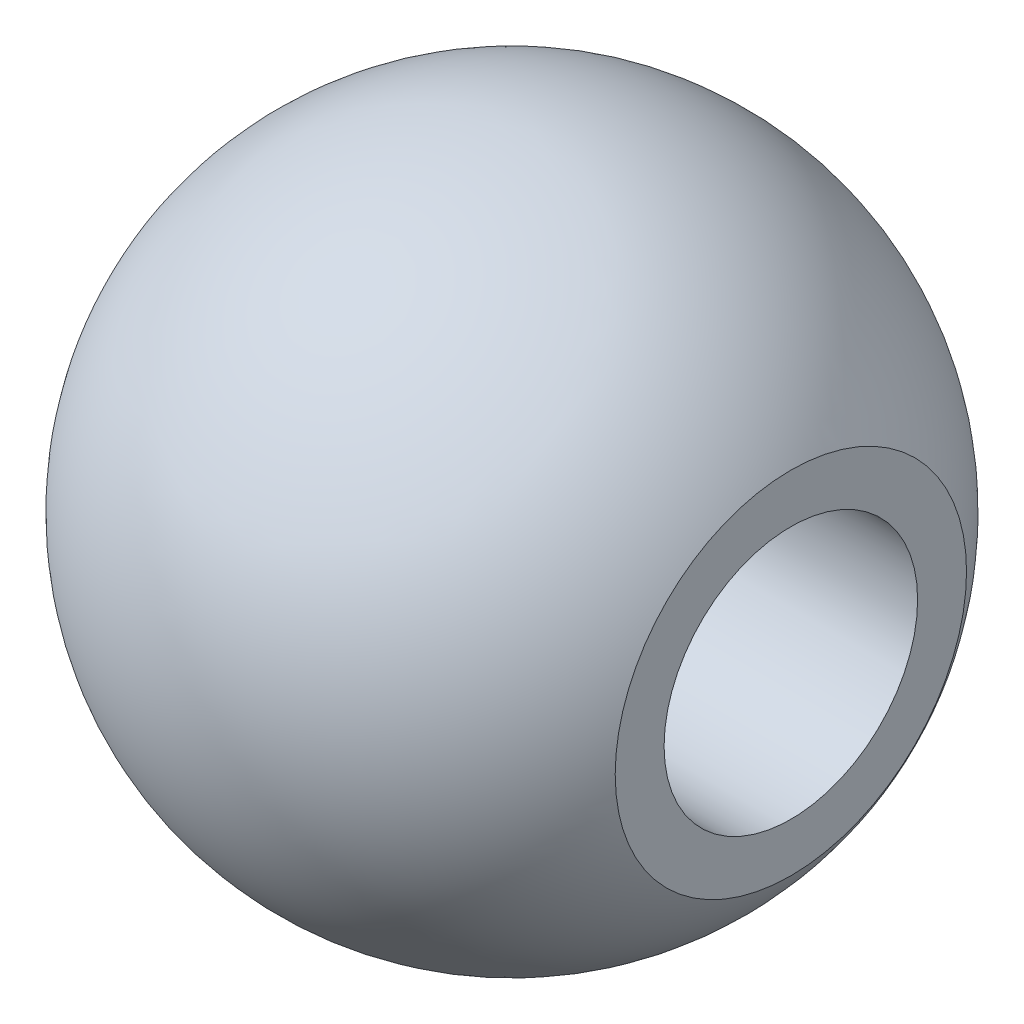
ISO-10303-21;
HEADER;
FILE_DESCRIPTION(('STEP AP214'),'2;1');
FILE_NAME('part.step','',(''),(''),'','','');
FILE_SCHEMA(('AUTOMOTIVE_DESIGN { 1 0 10303 214 1 1 1 1 }'));
ENDSEC;
DATA;
#1=APPLICATION_CONTEXT('core data for automotive mechanical design processes');
#2=APPLICATION_PROTOCOL_DEFINITION('international standard','automotive_design',2000,#1);
#3=PRODUCT_CONTEXT('',#1,'mechanical');
#4=PRODUCT('Part','Part','',(#3));
#5=PRODUCT_RELATED_PRODUCT_CATEGORY('part','',(#4));
#6=PRODUCT_DEFINITION_FORMATION('','',#4);
#7=PRODUCT_DEFINITION_CONTEXT('part definition',#1,'design');
#8=PRODUCT_DEFINITION('design','',#6,#7);
#9=PRODUCT_DEFINITION_SHAPE('','',#8);
#10=(LENGTH_UNIT() NAMED_UNIT(*) SI_UNIT(.MILLI.,.METRE.));
#11=(NAMED_UNIT(*) PLANE_ANGLE_UNIT() SI_UNIT($,.RADIAN.));
#12=(NAMED_UNIT(*) SI_UNIT($,.STERADIAN.) SOLID_ANGLE_UNIT());
#13=UNCERTAINTY_MEASURE_WITH_UNIT(LENGTH_MEASURE(1.E-05),#10,'distance_accuracy_value','');
#14=(GEOMETRIC_REPRESENTATION_CONTEXT(3) GLOBAL_UNCERTAINTY_ASSIGNED_CONTEXT((#13)) GLOBAL_UNIT_ASSIGNED_CONTEXT((#10,
#11,#12)) REPRESENTATION_CONTEXT('',''));
#15=CARTESIAN_POINT('',(0.,0.,0.));
#16=DIRECTION('',(0.,0.,1.));
#17=DIRECTION('',(1.,0.,0.));
#18=AXIS2_PLACEMENT_3D('',#15,#16,#17);
#19=CARTESIAN_POINT('',(0.,0.,0.));
#20=DIRECTION('',(0.,1.,0.));
#21=DIRECTION('',(1.,0.,0.));
#22=AXIS2_PLACEMENT_3D('',#19,#20,#21);
#23=SPHERICAL_SURFACE('',#22,2.6);
#24=CARTESIAN_POINT('',(0.,0.,0.));
#25=DIRECTION('',(1.,0.,0.));
#26=DIRECTION('',(0.,0.,-1.));
#27=AXIS2_PLACEMENT_3D('',#24,#25,#26);
#28=SPHERICAL_SURFACE('',#27,2.6);
#29=CARTESIAN_POINT('',(-2.2,0.,0.));
#30=DIRECTION('',(1.,0.,0.));
#31=DIRECTION('',(0.,0.,-1.));
#32=AXIS2_PLACEMENT_3D('',#29,#30,#31);
#33=CIRCLE('',#32,1.3856406460551);
#34=CARTESIAN_POINT('',(-2.2,0.,-1.3856406460551));
#35=VERTEX_POINT('',#34);
#36=EDGE_CURVE('E37',#35,#35,#33,.T.);
#37=ORIENTED_EDGE('',*,*,#36,.T.);
#38=EDGE_LOOP('',(#37));
#39=FACE_BOUND('',#38,.T.);
#40=CARTESIAN_POINT('',(2.2,0.,0.));
#41=DIRECTION('',(1.,0.,0.));
#42=DIRECTION('',(0.,1.,0.));
#43=AXIS2_PLACEMENT_3D('',#40,#41,#42);
#44=CIRCLE('',#43,1.3856406460551);
#45=CARTESIAN_POINT('',(2.2,1.3856406460551,0.));
#46=VERTEX_POINT('',#45);
#47=EDGE_CURVE('E10',#46,#46,#44,.T.);
#48=ORIENTED_EDGE('',*,*,#47,.F.);
#49=EDGE_LOOP('',(#48));
#50=FACE_BOUND('',#49,.T.);
#51=ADVANCED_FACE('F34',(#39,#50),#28,.T.);
#52=CARTESIAN_POINT('',(2.2,-8.45104458570028,-2.6));
#53=DIRECTION('',(1.,0.,0.));
#54=DIRECTION('',(0.,1.,0.));
#55=AXIS2_PLACEMENT_3D('',#52,#53,#54);
#56=PLANE('',#55);
#57=CARTESIAN_POINT('',(2.2,0.,0.));
#58=DIRECTION('',(1.,0.,0.));
#59=DIRECTION('',(0.,0.,-1.));
#60=AXIS2_PLACEMENT_3D('',#57,#58,#59);
#61=CIRCLE('',#60,1.);
#62=CARTESIAN_POINT('',(2.2,0.,-1.));
#63=VERTEX_POINT('',#62);
#64=EDGE_CURVE('E46',#63,#63,#61,.T.);
#65=ORIENTED_EDGE('',*,*,#64,.F.);
#66=EDGE_LOOP('',(#65));
#67=FACE_BOUND('',#66,.T.);
#68=ORIENTED_EDGE('',*,*,#47,.T.);
#69=EDGE_LOOP('',(#68));
#70=FACE_BOUND('',#69,.T.);
#71=ADVANCED_FACE('F61',(#67,#70),#56,.T.);
#72=CARTESIAN_POINT('',(-2.2,-4.76885260335514,-2.6));
#73=DIRECTION('',(1.,0.,0.));
#74=DIRECTION('',(0.,0.,-1.));
#75=AXIS2_PLACEMENT_3D('',#72,#73,#74);
#76=PLANE('',#75);
#77=CARTESIAN_POINT('',(-2.2,0.,0.));
#78=DIRECTION('',(1.,0.,0.));
#79=DIRECTION('',(0.,0.,-1.));
#80=AXIS2_PLACEMENT_3D('',#77,#78,#79);
#81=CIRCLE('',#80,1.);
#82=CARTESIAN_POINT('',(-2.2,0.,-1.));
#83=VERTEX_POINT('',#82);
#84=EDGE_CURVE('E44',#83,#83,#81,.T.);
#85=ORIENTED_EDGE('',*,*,#84,.T.);
#86=EDGE_LOOP('',(#85));
#87=FACE_BOUND('',#86,.T.);
#88=ORIENTED_EDGE('',*,*,#36,.F.);
#89=EDGE_LOOP('',(#88));
#90=FACE_BOUND('',#89,.T.);
#91=ADVANCED_FACE('F52',(#87,#90),#76,.F.);
#92=CARTESIAN_POINT('',(-2.2,0.,0.));
#93=DIRECTION('',(1.,0.,0.));
#94=DIRECTION('',(0.,0.,-1.));
#95=AXIS2_PLACEMENT_3D('',#92,#93,#94);
#96=CYLINDRICAL_SURFACE('',#95,1.);
#97=ORIENTED_EDGE('',*,*,#84,.F.);
#98=EDGE_LOOP('',(#97));
#99=FACE_BOUND('',#98,.T.);
#100=ORIENTED_EDGE('',*,*,#64,.T.);
#101=EDGE_LOOP('',(#100));
#102=FACE_BOUND('',#101,.T.);
#103=ADVANCED_FACE('F55',(#99,#102),#96,.F.);
#104=CLOSED_SHELL('',(#51,#71,#91,#103));
#105=MANIFOLD_SOLID_BREP('B2',#104);
#106=ADVANCED_BREP_SHAPE_REPRESENTATION('',(#18,#105),#14);
#107=SHAPE_DEFINITION_REPRESENTATION(#9,#106);
ENDSEC;
END-ISO-10303-21;
